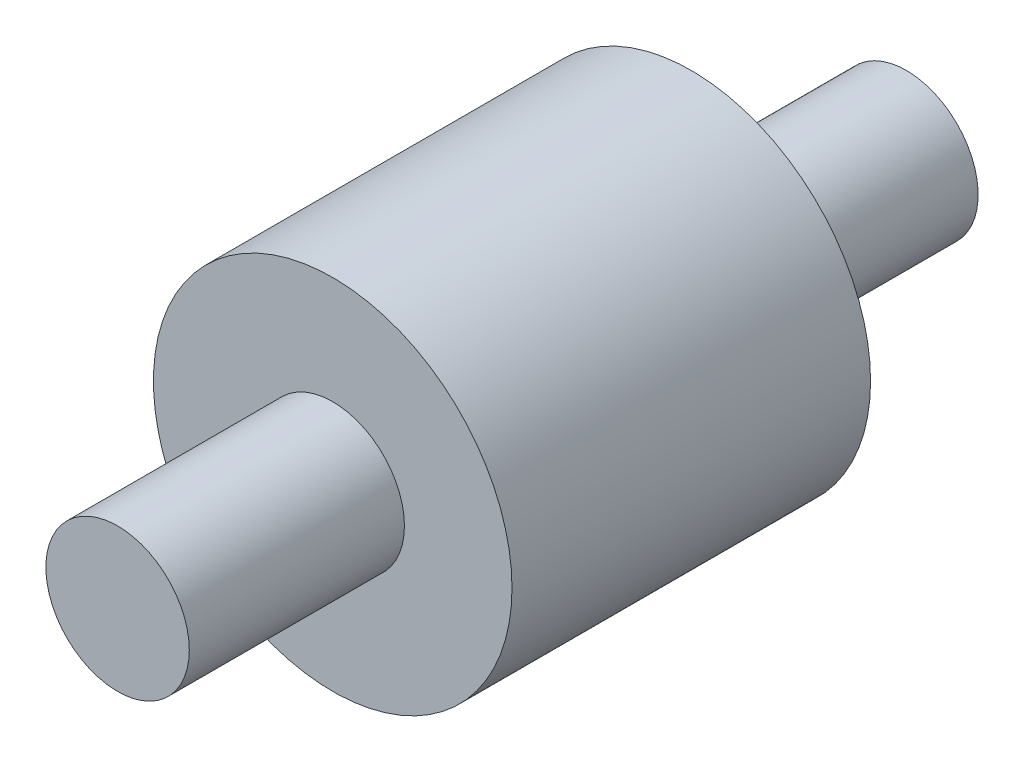
ISO-10303-21;
HEADER;
FILE_DESCRIPTION(('STEP AP214'),'2;1');
FILE_NAME('part.step','',(''),(''),'','','');
FILE_SCHEMA(('AUTOMOTIVE_DESIGN { 1 0 10303 214 1 1 1 1 }'));
ENDSEC;
DATA;
#1=APPLICATION_CONTEXT('core data for automotive mechanical design processes');
#2=APPLICATION_PROTOCOL_DEFINITION('international standard','automotive_design',2000,#1);
#3=PRODUCT_CONTEXT('',#1,'mechanical');
#4=PRODUCT('Part','Part','',(#3));
#5=PRODUCT_RELATED_PRODUCT_CATEGORY('part','',(#4));
#6=PRODUCT_DEFINITION_FORMATION('','',#4);
#7=PRODUCT_DEFINITION_CONTEXT('part definition',#1,'design');
#8=PRODUCT_DEFINITION('design','',#6,#7);
#9=PRODUCT_DEFINITION_SHAPE('','',#8);
#10=(LENGTH_UNIT() NAMED_UNIT(*) SI_UNIT(.MILLI.,.METRE.));
#11=(NAMED_UNIT(*) PLANE_ANGLE_UNIT() SI_UNIT($,.RADIAN.));
#12=(NAMED_UNIT(*) SI_UNIT($,.STERADIAN.) SOLID_ANGLE_UNIT());
#13=UNCERTAINTY_MEASURE_WITH_UNIT(LENGTH_MEASURE(1.E-05),#10,'distance_accuracy_value','');
#14=(GEOMETRIC_REPRESENTATION_CONTEXT(3) GLOBAL_UNCERTAINTY_ASSIGNED_CONTEXT((#13)) GLOBAL_UNIT_ASSIGNED_CONTEXT((#10,
#11,#12)) REPRESENTATION_CONTEXT('',''));
#15=CARTESIAN_POINT('',(0.,0.,0.));
#16=DIRECTION('',(0.,0.,1.));
#17=DIRECTION('',(1.,0.,0.));
#18=AXIS2_PLACEMENT_3D('',#15,#16,#17);
#19=CARTESIAN_POINT('',(0.,0.,25.));
#20=DIRECTION('',(0.,0.,-1.));
#21=DIRECTION('',(-1.,0.,0.));
#22=AXIS2_PLACEMENT_3D('',#19,#20,#21);
#23=CYLINDRICAL_SURFACE('',#22,25.);
#24=CARTESIAN_POINT('',(0.,0.,25.));
#25=DIRECTION('',(0.,0.,1.));
#26=DIRECTION('',(1.,0.,0.));
#27=AXIS2_PLACEMENT_3D('',#24,#25,#26);
#28=CIRCLE('',#27,25.);
#29=CARTESIAN_POINT('',(25.,0.,25.));
#30=VERTEX_POINT('',#29);
#31=EDGE_CURVE('E51',#30,#30,#28,.T.);
#32=ORIENTED_EDGE('',*,*,#31,.F.);
#33=EDGE_LOOP('',(#32));
#34=FACE_BOUND('',#33,.T.);
#35=CARTESIAN_POINT('',(0.,0.,-25.));
#36=DIRECTION('',(0.,0.,1.));
#37=DIRECTION('',(1.,0.,0.));
#38=AXIS2_PLACEMENT_3D('',#35,#36,#37);
#39=CIRCLE('',#38,25.);
#40=CARTESIAN_POINT('',(25.,0.,-25.));
#41=VERTEX_POINT('',#40);
#42=EDGE_CURVE('E40',#41,#41,#39,.T.);
#43=ORIENTED_EDGE('',*,*,#42,.T.);
#44=EDGE_LOOP('',(#43));
#45=FACE_BOUND('',#44,.T.);
#46=ADVANCED_FACE('F37',(#34,#45),#23,.T.);
#47=CARTESIAN_POINT('',(0.,0.,25.));
#48=DIRECTION('',(0.,0.,1.));
#49=DIRECTION('',(1.,0.,0.));
#50=AXIS2_PLACEMENT_3D('',#47,#48,#49);
#51=PLANE('',#50);
#52=CARTESIAN_POINT('',(0.,0.,25.));
#53=DIRECTION('',(0.,0.,1.));
#54=DIRECTION('',(1.,0.,0.));
#55=AXIS2_PLACEMENT_3D('',#52,#53,#54);
#56=CIRCLE('',#55,10.);
#57=CARTESIAN_POINT('',(10.,0.,25.));
#58=VERTEX_POINT('',#57);
#59=EDGE_CURVE('E10',#58,#58,#56,.T.);
#60=ORIENTED_EDGE('',*,*,#59,.F.);
#61=EDGE_LOOP('',(#60));
#62=FACE_BOUND('',#61,.T.);
#63=ORIENTED_EDGE('',*,*,#31,.T.);
#64=EDGE_LOOP('',(#63));
#65=FACE_BOUND('',#64,.T.);
#66=ADVANCED_FACE('F71',(#62,#65),#51,.T.);
#67=CARTESIAN_POINT('',(0.,0.,-25.));
#68=DIRECTION('',(0.,0.,1.));
#69=DIRECTION('',(1.,0.,0.));
#70=AXIS2_PLACEMENT_3D('',#67,#68,#69);
#71=PLANE('',#70);
#72=CARTESIAN_POINT('',(0.,0.,-25.));
#73=DIRECTION('',(0.,0.,-1.));
#74=DIRECTION('',(-1.,0.,0.));
#75=AXIS2_PLACEMENT_3D('',#72,#73,#74);
#76=CIRCLE('',#75,10.);
#77=CARTESIAN_POINT('',(-10.,0.,-25.));
#78=VERTEX_POINT('',#77);
#79=EDGE_CURVE('E45',#78,#78,#76,.T.);
#80=ORIENTED_EDGE('',*,*,#79,.F.);
#81=EDGE_LOOP('',(#80));
#82=FACE_BOUND('',#81,.T.);
#83=ORIENTED_EDGE('',*,*,#42,.F.);
#84=EDGE_LOOP('',(#83));
#85=FACE_BOUND('',#84,.T.);
#86=ADVANCED_FACE('F68',(#82,#85),#71,.F.);
#87=CARTESIAN_POINT('',(0.,0.,-55.));
#88=DIRECTION('',(0.,0.,1.));
#89=DIRECTION('',(1.,0.,0.));
#90=AXIS2_PLACEMENT_3D('',#87,#88,#89);
#91=CYLINDRICAL_SURFACE('',#90,10.);
#92=CARTESIAN_POINT('',(0.,0.,-55.));
#93=DIRECTION('',(0.,0.,-1.));
#94=DIRECTION('',(-1.,0.,0.));
#95=AXIS2_PLACEMENT_3D('',#92,#93,#94);
#96=CIRCLE('',#95,10.);
#97=CARTESIAN_POINT('',(-10.,0.,-55.));
#98=VERTEX_POINT('',#97);
#99=EDGE_CURVE('E56',#98,#98,#96,.T.);
#100=ORIENTED_EDGE('',*,*,#99,.F.);
#101=EDGE_LOOP('',(#100));
#102=FACE_BOUND('',#101,.T.);
#103=ORIENTED_EDGE('',*,*,#79,.T.);
#104=EDGE_LOOP('',(#103));
#105=FACE_BOUND('',#104,.T.);
#106=ADVANCED_FACE('F70',(#102,#105),#91,.T.);
#107=CARTESIAN_POINT('',(0.,0.,-55.));
#108=DIRECTION('',(0.,0.,-1.));
#109=DIRECTION('',(-1.,0.,0.));
#110=AXIS2_PLACEMENT_3D('',#107,#108,#109);
#111=PLANE('',#110);
#112=ORIENTED_EDGE('',*,*,#99,.T.);
#113=EDGE_LOOP('',(#112));
#114=FACE_BOUND('',#113,.T.);
#115=ADVANCED_FACE('F77',(#114),#111,.T.);
#116=CARTESIAN_POINT('',(0.,0.,55.));
#117=DIRECTION('',(0.,0.,-1.));
#118=DIRECTION('',(-1.,0.,0.));
#119=AXIS2_PLACEMENT_3D('',#116,#117,#118);
#120=CYLINDRICAL_SURFACE('',#119,10.);
#121=CARTESIAN_POINT('',(0.,0.,55.));
#122=DIRECTION('',(0.,0.,1.));
#123=DIRECTION('',(1.,0.,0.));
#124=AXIS2_PLACEMENT_3D('',#121,#122,#123);
#125=CIRCLE('',#124,10.);
#126=CARTESIAN_POINT('',(10.,0.,55.));
#127=VERTEX_POINT('',#126);
#128=EDGE_CURVE('E55',#127,#127,#125,.T.);
#129=ORIENTED_EDGE('',*,*,#128,.F.);
#130=EDGE_LOOP('',(#129));
#131=FACE_BOUND('',#130,.T.);
#132=ORIENTED_EDGE('',*,*,#59,.T.);
#133=EDGE_LOOP('',(#132));
#134=FACE_BOUND('',#133,.T.);
#135=ADVANCED_FACE('F102',(#131,#134),#120,.T.);
#136=CARTESIAN_POINT('',(0.,0.,55.));
#137=DIRECTION('',(0.,0.,1.));
#138=DIRECTION('',(1.,0.,0.));
#139=AXIS2_PLACEMENT_3D('',#136,#137,#138);
#140=PLANE('',#139);
#141=ORIENTED_EDGE('',*,*,#128,.T.);
#142=EDGE_LOOP('',(#141));
#143=FACE_BOUND('',#142,.T.);
#144=ADVANCED_FACE('F107',(#143),#140,.T.);
#145=CLOSED_SHELL('',(#46,#66,#86,#106,#115,#135,#144));
#146=MANIFOLD_SOLID_BREP('B2',#145);
#147=ADVANCED_BREP_SHAPE_REPRESENTATION('',(#18,#146),#14);
#148=SHAPE_DEFINITION_REPRESENTATION(#9,#147);
ENDSEC;
END-ISO-10303-21;
